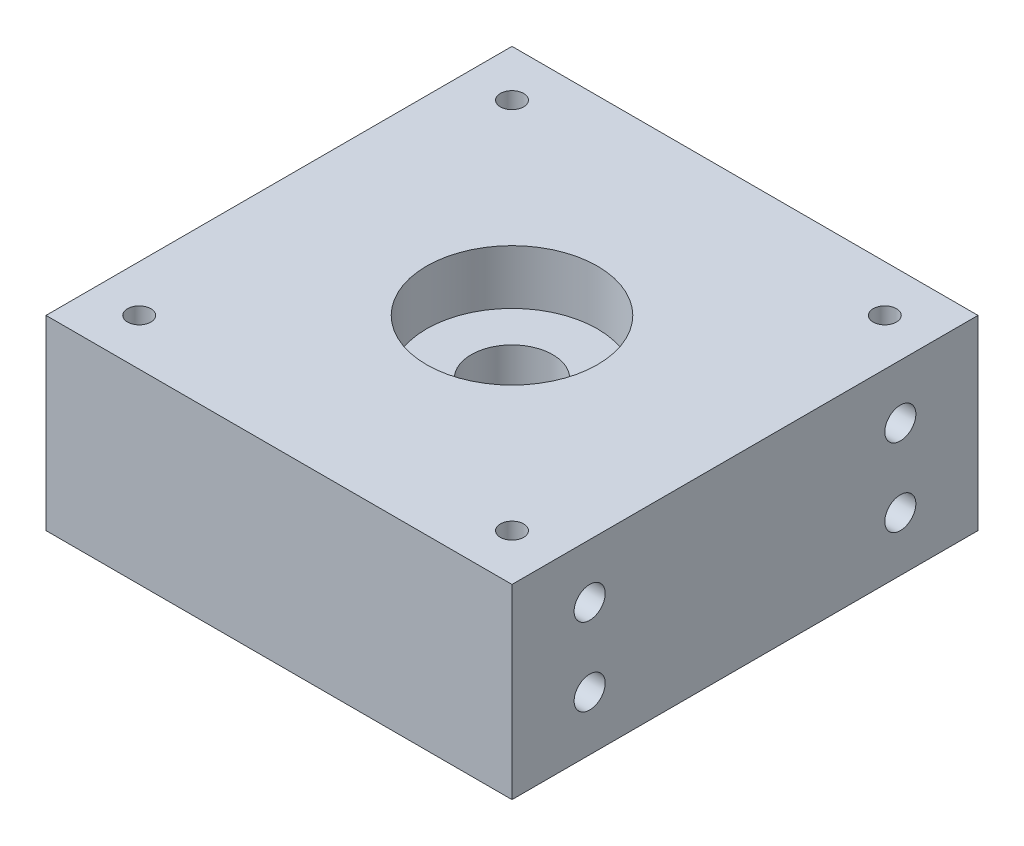
ISO-10303-21;
HEADER;
FILE_DESCRIPTION(('STEP AP214'),'2;1');
FILE_NAME('part.step','',(''),(''),'','','');
FILE_SCHEMA(('AUTOMOTIVE_DESIGN { 1 0 10303 214 1 1 1 1 }'));
ENDSEC;
DATA;
#1=APPLICATION_CONTEXT('core data for automotive mechanical design processes');
#2=APPLICATION_PROTOCOL_DEFINITION('international standard','automotive_design',2000,#1);
#3=PRODUCT_CONTEXT('',#1,'mechanical');
#4=PRODUCT('Part','Part','',(#3));
#5=PRODUCT_RELATED_PRODUCT_CATEGORY('part','',(#4));
#6=PRODUCT_DEFINITION_FORMATION('','',#4);
#7=PRODUCT_DEFINITION_CONTEXT('part definition',#1,'design');
#8=PRODUCT_DEFINITION('design','',#6,#7);
#9=PRODUCT_DEFINITION_SHAPE('','',#8);
#10=(LENGTH_UNIT() NAMED_UNIT(*) SI_UNIT(.MILLI.,.METRE.));
#11=(NAMED_UNIT(*) PLANE_ANGLE_UNIT() SI_UNIT($,.RADIAN.));
#12=(NAMED_UNIT(*) SI_UNIT($,.STERADIAN.) SOLID_ANGLE_UNIT());
#13=UNCERTAINTY_MEASURE_WITH_UNIT(LENGTH_MEASURE(1.E-05),#10,'distance_accuracy_value','');
#14=(GEOMETRIC_REPRESENTATION_CONTEXT(3) GLOBAL_UNCERTAINTY_ASSIGNED_CONTEXT((#13)) GLOBAL_UNIT_ASSIGNED_CONTEXT((#10,
#11,#12)) REPRESENTATION_CONTEXT('',''));
#15=CARTESIAN_POINT('',(0.,0.,0.));
#16=DIRECTION('',(0.,0.,1.));
#17=DIRECTION('',(1.,0.,0.));
#18=AXIS2_PLACEMENT_3D('',#15,#16,#17);
#19=CARTESIAN_POINT('',(54.0014,8.0077,6.000003548781));
#20=DIRECTION('',(0.,1.,0.));
#21=DIRECTION('',(0.,0.,1.));
#22=AXIS2_PLACEMENT_3D('',#19,#20,#21);
#23=PLANE('',#22);
#24=CARTESIAN_POINT('',(54.0014,8.0077,6.000003548781));
#25=DIRECTION('',(0.,1.,0.));
#26=DIRECTION('',(0.,0.,1.));
#27=AXIS2_PLACEMENT_3D('',#24,#25,#26);
#28=CIRCLE('',#27,1.5);
#29=CARTESIAN_POINT('',(54.0014,8.0077,7.500003548781));
#30=VERTEX_POINT('',#29);
#31=EDGE_CURVE('E19',#30,#30,#28,.F.);
#32=ORIENTED_EDGE('',*,*,#31,.T.);
#33=EDGE_LOOP('',(#32));
#34=FACE_BOUND('',#33,.T.);
#35=ADVANCED_FACE('F16',(#34),#23,.F.);
#36=CARTESIAN_POINT('',(45.5014,10.0077,14.500003548781));
#37=DIRECTION('',(0.,1.,0.));
#38=DIRECTION('',(0.,0.,1.));
#39=AXIS2_PLACEMENT_3D('',#36,#37,#38);
#40=PLANE('',#39);
#41=CARTESIAN_POINT('',(45.5014,10.0077,14.500003548781));
#42=DIRECTION('',(0.,1.,0.));
#43=DIRECTION('',(0.,0.,1.));
#44=AXIS2_PLACEMENT_3D('',#41,#42,#43);
#45=CIRCLE('',#44,2.);
#46=CARTESIAN_POINT('',(45.5014,10.0077,16.500003548781));
#47=VERTEX_POINT('',#46);
#48=EDGE_CURVE('E212',#47,#47,#45,.F.);
#49=ORIENTED_EDGE('',*,*,#48,.T.);
#50=EDGE_LOOP('',(#49));
#51=FACE_BOUND('',#50,.T.);
#52=ADVANCED_FACE('F372',(#51),#40,.F.);
#53=CARTESIAN_POINT('',(6.0014,8.0077,6.000003548781));
#54=DIRECTION('',(0.,1.,0.));
#55=DIRECTION('',(0.,0.,1.));
#56=AXIS2_PLACEMENT_3D('',#53,#54,#55);
#57=PLANE('',#56);
#58=CARTESIAN_POINT('',(6.0014,8.0077,6.000003548781));
#59=DIRECTION('',(0.,1.,0.));
#60=DIRECTION('',(0.,0.,1.));
#61=AXIS2_PLACEMENT_3D('',#58,#59,#60);
#62=CIRCLE('',#61,1.5);
#63=CARTESIAN_POINT('',(6.0014,8.0077,7.500003548781));
#64=VERTEX_POINT('',#63);
#65=EDGE_CURVE('E210',#64,#64,#62,.F.);
#66=ORIENTED_EDGE('',*,*,#65,.T.);
#67=EDGE_LOOP('',(#66));
#68=FACE_BOUND('',#67,.T.);
#69=ADVANCED_FACE('F369',(#68),#57,.F.);
#70=CARTESIAN_POINT('',(14.5014,10.0077,14.500003548781));
#71=DIRECTION('',(0.,1.,0.));
#72=DIRECTION('',(0.,0.,1.));
#73=AXIS2_PLACEMENT_3D('',#70,#71,#72);
#74=PLANE('',#73);
#75=CARTESIAN_POINT('',(14.5014,10.0077,14.500003548781));
#76=DIRECTION('',(0.,1.,0.));
#77=DIRECTION('',(0.,0.,1.));
#78=AXIS2_PLACEMENT_3D('',#75,#76,#77);
#79=CIRCLE('',#78,2.);
#80=CARTESIAN_POINT('',(14.5014,10.0077,16.500003548781));
#81=VERTEX_POINT('',#80);
#82=EDGE_CURVE('E207',#81,#81,#79,.F.);
#83=ORIENTED_EDGE('',*,*,#82,.T.);
#84=EDGE_LOOP('',(#83));
#85=FACE_BOUND('',#84,.T.);
#86=ADVANCED_FACE('F371',(#85),#74,.F.);
#87=CARTESIAN_POINT('',(45.5014,10.0077,45.500003548781));
#88=DIRECTION('',(0.,1.,0.));
#89=DIRECTION('',(0.,0.,1.));
#90=AXIS2_PLACEMENT_3D('',#87,#88,#89);
#91=PLANE('',#90);
#92=CARTESIAN_POINT('',(45.5014,10.0077,45.500003548781));
#93=DIRECTION('',(0.,1.,0.));
#94=DIRECTION('',(0.,0.,1.));
#95=AXIS2_PLACEMENT_3D('',#92,#93,#94);
#96=CIRCLE('',#95,2.);
#97=CARTESIAN_POINT('',(45.5014,10.0077,47.500003548781));
#98=VERTEX_POINT('',#97);
#99=EDGE_CURVE('E204',#98,#98,#96,.F.);
#100=ORIENTED_EDGE('',*,*,#99,.T.);
#101=EDGE_LOOP('',(#100));
#102=FACE_BOUND('',#101,.T.);
#103=ADVANCED_FACE('F378',(#102),#91,.F.);
#104=CARTESIAN_POINT('',(54.0014,8.0077,54.000003548781));
#105=DIRECTION('',(0.,1.,0.));
#106=DIRECTION('',(0.,0.,1.));
#107=AXIS2_PLACEMENT_3D('',#104,#105,#106);
#108=PLANE('',#107);
#109=CARTESIAN_POINT('',(54.0014,8.0077,54.000003548781));
#110=DIRECTION('',(0.,1.,0.));
#111=DIRECTION('',(0.,0.,1.));
#112=AXIS2_PLACEMENT_3D('',#109,#110,#111);
#113=CIRCLE('',#112,1.5);
#114=CARTESIAN_POINT('',(54.0014,8.0077,55.500003548781));
#115=VERTEX_POINT('',#114);
#116=EDGE_CURVE('E201',#115,#115,#113,.F.);
#117=ORIENTED_EDGE('',*,*,#116,.T.);
#118=EDGE_LOOP('',(#117));
#119=FACE_BOUND('',#118,.T.);
#120=ADVANCED_FACE('F384',(#119),#108,.F.);
#121=CARTESIAN_POINT('',(14.5014,10.0077,45.500003548781));
#122=DIRECTION('',(0.,1.,0.));
#123=DIRECTION('',(0.,0.,1.));
#124=AXIS2_PLACEMENT_3D('',#121,#122,#123);
#125=PLANE('',#124);
#126=CARTESIAN_POINT('',(14.5014,10.0077,45.500003548781));
#127=DIRECTION('',(0.,1.,0.));
#128=DIRECTION('',(0.,0.,1.));
#129=AXIS2_PLACEMENT_3D('',#126,#127,#128);
#130=CIRCLE('',#129,2.);
#131=CARTESIAN_POINT('',(14.5014,10.0077,47.500003548781));
#132=VERTEX_POINT('',#131);
#133=EDGE_CURVE('E195',#132,#132,#130,.F.);
#134=ORIENTED_EDGE('',*,*,#133,.T.);
#135=EDGE_LOOP('',(#134));
#136=FACE_BOUND('',#135,.T.);
#137=ADVANCED_FACE('F388',(#136),#125,.F.);
#138=CARTESIAN_POINT('',(6.0014,8.0077,54.000003548781));
#139=DIRECTION('',(0.,1.,0.));
#140=DIRECTION('',(0.,0.,1.));
#141=AXIS2_PLACEMENT_3D('',#138,#139,#140);
#142=PLANE('',#141);
#143=CARTESIAN_POINT('',(6.0014,8.0077,54.000003548781));
#144=DIRECTION('',(0.,1.,0.));
#145=DIRECTION('',(0.,0.,1.));
#146=AXIS2_PLACEMENT_3D('',#143,#144,#145);
#147=CIRCLE('',#146,1.5);
#148=CARTESIAN_POINT('',(6.0014,8.0077,55.500003548781));
#149=VERTEX_POINT('',#148);
#150=EDGE_CURVE('E192',#149,#149,#147,.F.);
#151=ORIENTED_EDGE('',*,*,#150,.T.);
#152=EDGE_LOOP('',(#151));
#153=FACE_BOUND('',#152,.T.);
#154=ADVANCED_FACE('F392',(#153),#142,.F.);
#155=CARTESIAN_POINT('',(30.0014,7.0077,30.000003548781));
#156=DIRECTION('',(0.,1.,0.));
#157=DIRECTION('',(0.,0.,1.));
#158=AXIS2_PLACEMENT_3D('',#155,#156,#157);
#159=PLANE('',#158);
#160=CARTESIAN_POINT('',(30.0014,7.0077,30.000003548781));
#161=DIRECTION('',(0.,1.,0.));
#162=DIRECTION('',(0.,0.,1.));
#163=AXIS2_PLACEMENT_3D('',#160,#161,#162);
#164=CIRCLE('',#163,5.25);
#165=CARTESIAN_POINT('',(30.0014,7.0077,35.250003548781));
#166=VERTEX_POINT('',#165);
#167=EDGE_CURVE('E189',#166,#166,#164,.T.);
#168=ORIENTED_EDGE('',*,*,#167,.T.);
#169=EDGE_LOOP('',(#168));
#170=FACE_BOUND('',#169,.T.);
#171=CARTESIAN_POINT('',(30.0014,7.0077,30.000003548781));
#172=DIRECTION('',(0.,1.,0.));
#173=DIRECTION('',(0.,0.,1.));
#174=AXIS2_PLACEMENT_3D('',#171,#172,#173);
#175=CIRCLE('',#174,11.);
#176=CARTESIAN_POINT('',(30.0014,7.0077,41.000003548781));
#177=VERTEX_POINT('',#176);
#178=EDGE_CURVE('E198',#177,#177,#175,.F.);
#179=ORIENTED_EDGE('',*,*,#178,.T.);
#180=EDGE_LOOP('',(#179));
#181=FACE_BOUND('',#180,.T.);
#182=ADVANCED_FACE('F396',(#170,#181),#159,.F.);
#183=CARTESIAN_POINT('',(50.0014,7.0077,50.000003548781));
#184=DIRECTION('',(-1.,0.,0.));
#185=DIRECTION('',(0.,0.,1.));
#186=AXIS2_PLACEMENT_3D('',#183,#184,#185);
#187=PLANE('',#186);
#188=CARTESIAN_POINT('',(50.0014,7.0077,50.000003548781));
#189=DIRECTION('',(-1.,0.,0.));
#190=DIRECTION('',(0.,0.,1.));
#191=AXIS2_PLACEMENT_3D('',#188,#189,#190);
#192=CIRCLE('',#191,2.);
#193=CARTESIAN_POINT('',(50.0014,7.0077,52.000003548781));
#194=VERTEX_POINT('',#193);
#195=EDGE_CURVE('E186',#194,#194,#192,.F.);
#196=ORIENTED_EDGE('',*,*,#195,.T.);
#197=EDGE_LOOP('',(#196));
#198=FACE_BOUND('',#197,.T.);
#199=ADVANCED_FACE('F400',(#198),#187,.F.);
#200=CARTESIAN_POINT('',(50.0014,17.0077,50.000003548781));
#201=DIRECTION('',(-1.,0.,0.));
#202=DIRECTION('',(0.,0.,1.));
#203=AXIS2_PLACEMENT_3D('',#200,#201,#202);
#204=PLANE('',#203);
#205=CARTESIAN_POINT('',(50.0014,17.0077,50.000003548781));
#206=DIRECTION('',(-1.,0.,0.));
#207=DIRECTION('',(0.,0.,1.));
#208=AXIS2_PLACEMENT_3D('',#205,#206,#207);
#209=CIRCLE('',#208,2.);
#210=CARTESIAN_POINT('',(50.0014,17.0077,52.000003548781));
#211=VERTEX_POINT('',#210);
#212=EDGE_CURVE('E183',#211,#211,#209,.F.);
#213=ORIENTED_EDGE('',*,*,#212,.T.);
#214=EDGE_LOOP('',(#213));
#215=FACE_BOUND('',#214,.T.);
#216=ADVANCED_FACE('F404',(#215),#204,.F.);
#217=CARTESIAN_POINT('',(50.0014,7.0077,10.000003548781));
#218=DIRECTION('',(-1.,0.,0.));
#219=DIRECTION('',(0.,0.,1.));
#220=AXIS2_PLACEMENT_3D('',#217,#218,#219);
#221=PLANE('',#220);
#222=CARTESIAN_POINT('',(50.0014,7.0077,10.000003548781));
#223=DIRECTION('',(-1.,0.,0.));
#224=DIRECTION('',(0.,0.,1.));
#225=AXIS2_PLACEMENT_3D('',#222,#223,#224);
#226=CIRCLE('',#225,2.);
#227=CARTESIAN_POINT('',(50.0014,7.0077,12.000003548781));
#228=VERTEX_POINT('',#227);
#229=EDGE_CURVE('E180',#228,#228,#226,.F.);
#230=ORIENTED_EDGE('',*,*,#229,.T.);
#231=EDGE_LOOP('',(#230));
#232=FACE_BOUND('',#231,.T.);
#233=ADVANCED_FACE('F408',(#232),#221,.F.);
#234=CARTESIAN_POINT('',(50.0014,17.0077,10.000003548781));
#235=DIRECTION('',(-1.,0.,0.));
#236=DIRECTION('',(0.,0.,1.));
#237=AXIS2_PLACEMENT_3D('',#234,#235,#236);
#238=PLANE('',#237);
#239=CARTESIAN_POINT('',(50.0014,17.0077,10.000003548781));
#240=DIRECTION('',(-1.,0.,0.));
#241=DIRECTION('',(0.,0.,1.));
#242=AXIS2_PLACEMENT_3D('',#239,#240,#241);
#243=CIRCLE('',#242,2.);
#244=CARTESIAN_POINT('',(50.0014,17.0077,12.000003548781));
#245=VERTEX_POINT('',#244);
#246=EDGE_CURVE('E177',#245,#245,#243,.F.);
#247=ORIENTED_EDGE('',*,*,#246,.T.);
#248=EDGE_LOOP('',(#247));
#249=FACE_BOUND('',#248,.T.);
#250=ADVANCED_FACE('F412',(#249),#238,.F.);
#251=CARTESIAN_POINT('',(10.0014,7.0077,50.000003548781));
#252=DIRECTION('',(1.,0.,0.));
#253=DIRECTION('',(0.,0.,-1.));
#254=AXIS2_PLACEMENT_3D('',#251,#252,#253);
#255=PLANE('',#254);
#256=CARTESIAN_POINT('',(10.0014,7.0077,50.000003548781));
#257=DIRECTION('',(1.,0.,0.));
#258=DIRECTION('',(0.,0.,-1.));
#259=AXIS2_PLACEMENT_3D('',#256,#257,#258);
#260=CIRCLE('',#259,2.);
#261=CARTESIAN_POINT('',(10.0014,7.0077,48.000003548781));
#262=VERTEX_POINT('',#261);
#263=EDGE_CURVE('E174',#262,#262,#260,.F.);
#264=ORIENTED_EDGE('',*,*,#263,.T.);
#265=EDGE_LOOP('',(#264));
#266=FACE_BOUND('',#265,.T.);
#267=ADVANCED_FACE('F416',(#266),#255,.F.);
#268=CARTESIAN_POINT('',(10.0014,17.0077,50.000003548781));
#269=DIRECTION('',(1.,0.,0.));
#270=DIRECTION('',(0.,0.,-1.));
#271=AXIS2_PLACEMENT_3D('',#268,#269,#270);
#272=PLANE('',#271);
#273=CARTESIAN_POINT('',(10.0014,17.0077,50.000003548781));
#274=DIRECTION('',(1.,0.,0.));
#275=DIRECTION('',(0.,0.,-1.));
#276=AXIS2_PLACEMENT_3D('',#273,#274,#275);
#277=CIRCLE('',#276,2.);
#278=CARTESIAN_POINT('',(10.0014,17.0077,48.000003548781));
#279=VERTEX_POINT('',#278);
#280=EDGE_CURVE('E171',#279,#279,#277,.F.);
#281=ORIENTED_EDGE('',*,*,#280,.T.);
#282=EDGE_LOOP('',(#281));
#283=FACE_BOUND('',#282,.T.);
#284=ADVANCED_FACE('F420',(#283),#272,.F.);
#285=CARTESIAN_POINT('',(10.0014,7.0077,10.000003548781));
#286=DIRECTION('',(1.,0.,0.));
#287=DIRECTION('',(0.,0.,-1.));
#288=AXIS2_PLACEMENT_3D('',#285,#286,#287);
#289=PLANE('',#288);
#290=CARTESIAN_POINT('',(10.0014,7.0077,10.000003548781));
#291=DIRECTION('',(1.,0.,0.));
#292=DIRECTION('',(0.,0.,-1.));
#293=AXIS2_PLACEMENT_3D('',#290,#291,#292);
#294=CIRCLE('',#293,2.);
#295=CARTESIAN_POINT('',(10.0014,7.0077,8.000003548781));
#296=VERTEX_POINT('',#295);
#297=EDGE_CURVE('E168',#296,#296,#294,.F.);
#298=ORIENTED_EDGE('',*,*,#297,.T.);
#299=EDGE_LOOP('',(#298));
#300=FACE_BOUND('',#299,.T.);
#301=ADVANCED_FACE('F234',(#300),#289,.F.);
#302=CARTESIAN_POINT('',(10.0014,17.0077,10.000003548781));
#303=DIRECTION('',(1.,0.,0.));
#304=DIRECTION('',(0.,0.,-1.));
#305=AXIS2_PLACEMENT_3D('',#302,#303,#304);
#306=PLANE('',#305);
#307=CARTESIAN_POINT('',(10.0014,17.0077,10.000003548781));
#308=DIRECTION('',(1.,0.,0.));
#309=DIRECTION('',(0.,0.,-1.));
#310=AXIS2_PLACEMENT_3D('',#307,#308,#309);
#311=CIRCLE('',#310,2.);
#312=CARTESIAN_POINT('',(10.0014,17.0077,8.000003548781));
#313=VERTEX_POINT('',#312);
#314=EDGE_CURVE('E165',#313,#313,#311,.F.);
#315=ORIENTED_EDGE('',*,*,#314,.T.);
#316=EDGE_LOOP('',(#315));
#317=FACE_BOUND('',#316,.T.);
#318=ADVANCED_FACE('F223',(#317),#306,.F.);
#319=CARTESIAN_POINT('',(54.0014,0.007700000000114,6.000003548781));
#320=DIRECTION('',(0.,1.,0.));
#321=DIRECTION('',(0.,0.,1.));
#322=AXIS2_PLACEMENT_3D('',#319,#320,#321);
#323=CYLINDRICAL_SURFACE('',#322,1.5);
#324=CARTESIAN_POINT('',(54.0014,0.0077,6.000003548781));
#325=DIRECTION('',(0.,1.,0.));
#326=DIRECTION('',(0.,0.,1.));
#327=AXIS2_PLACEMENT_3D('',#324,#325,#326);
#328=CIRCLE('',#327,1.5);
#329=CARTESIAN_POINT('',(54.0014,0.0077,7.500003548781));
#330=VERTEX_POINT('',#329);
#331=EDGE_CURVE('E162',#330,#330,#328,.F.);
#332=ORIENTED_EDGE('',*,*,#331,.T.);
#333=EDGE_LOOP('',(#332));
#334=FACE_BOUND('',#333,.T.);
#335=ORIENTED_EDGE('',*,*,#31,.F.);
#336=EDGE_LOOP('',(#335));
#337=FACE_BOUND('',#336,.T.);
#338=ADVANCED_FACE('F220',(#334,#337),#323,.F.);
#339=CARTESIAN_POINT('',(45.5014,0.007700000000114,14.500003548781));
#340=DIRECTION('',(0.,1.,0.));
#341=DIRECTION('',(0.,0.,1.));
#342=AXIS2_PLACEMENT_3D('',#339,#340,#341);
#343=CYLINDRICAL_SURFACE('',#342,2.);
#344=CARTESIAN_POINT('',(45.5014,0.0077,14.500003548781));
#345=DIRECTION('',(0.,1.,0.));
#346=DIRECTION('',(0.,0.,1.));
#347=AXIS2_PLACEMENT_3D('',#344,#345,#346);
#348=CIRCLE('',#347,2.);
#349=CARTESIAN_POINT('',(45.5014,0.0077,16.500003548781));
#350=VERTEX_POINT('',#349);
#351=EDGE_CURVE('E159',#350,#350,#348,.F.);
#352=ORIENTED_EDGE('',*,*,#351,.T.);
#353=EDGE_LOOP('',(#352));
#354=FACE_BOUND('',#353,.T.);
#355=ORIENTED_EDGE('',*,*,#48,.F.);
#356=EDGE_LOOP('',(#355));
#357=FACE_BOUND('',#356,.T.);
#358=ADVANCED_FACE('F222',(#354,#357),#343,.F.);
#359=CARTESIAN_POINT('',(6.0014,0.007700000000114,6.000003548781));
#360=DIRECTION('',(0.,1.,0.));
#361=DIRECTION('',(0.,0.,1.));
#362=AXIS2_PLACEMENT_3D('',#359,#360,#361);
#363=CYLINDRICAL_SURFACE('',#362,1.5);
#364=CARTESIAN_POINT('',(6.0014,0.0077,6.000003548781));
#365=DIRECTION('',(0.,1.,0.));
#366=DIRECTION('',(0.,0.,1.));
#367=AXIS2_PLACEMENT_3D('',#364,#365,#366);
#368=CIRCLE('',#367,1.5);
#369=CARTESIAN_POINT('',(6.0014,0.0077,7.500003548781));
#370=VERTEX_POINT('',#369);
#371=EDGE_CURVE('E156',#370,#370,#368,.F.);
#372=ORIENTED_EDGE('',*,*,#371,.T.);
#373=EDGE_LOOP('',(#372));
#374=FACE_BOUND('',#373,.T.);
#375=ORIENTED_EDGE('',*,*,#65,.F.);
#376=EDGE_LOOP('',(#375));
#377=FACE_BOUND('',#376,.T.);
#378=ADVANCED_FACE('F231',(#374,#377),#363,.F.);
#379=CARTESIAN_POINT('',(14.5014,0.007700000000114,14.500003548781));
#380=DIRECTION('',(0.,1.,0.));
#381=DIRECTION('',(0.,0.,1.));
#382=AXIS2_PLACEMENT_3D('',#379,#380,#381);
#383=CYLINDRICAL_SURFACE('',#382,2.);
#384=CARTESIAN_POINT('',(14.5014,0.0077,14.500003548781));
#385=DIRECTION('',(0.,1.,0.));
#386=DIRECTION('',(0.,0.,1.));
#387=AXIS2_PLACEMENT_3D('',#384,#385,#386);
#388=CIRCLE('',#387,2.);
#389=CARTESIAN_POINT('',(14.5014,0.0077,16.500003548781));
#390=VERTEX_POINT('',#389);
#391=EDGE_CURVE('E153',#390,#390,#388,.F.);
#392=ORIENTED_EDGE('',*,*,#391,.T.);
#393=EDGE_LOOP('',(#392));
#394=FACE_BOUND('',#393,.T.);
#395=ORIENTED_EDGE('',*,*,#82,.F.);
#396=EDGE_LOOP('',(#395));
#397=FACE_BOUND('',#396,.T.);
#398=ADVANCED_FACE('F356',(#394,#397),#383,.F.);
#399=CARTESIAN_POINT('',(45.5014,0.007700000000114,45.500003548781));
#400=DIRECTION('',(0.,1.,0.));
#401=DIRECTION('',(0.,0.,1.));
#402=AXIS2_PLACEMENT_3D('',#399,#400,#401);
#403=CYLINDRICAL_SURFACE('',#402,2.);
#404=CARTESIAN_POINT('',(45.5014,0.0077,45.500003548781));
#405=DIRECTION('',(0.,1.,0.));
#406=DIRECTION('',(0.,0.,1.));
#407=AXIS2_PLACEMENT_3D('',#404,#405,#406);
#408=CIRCLE('',#407,2.);
#409=CARTESIAN_POINT('',(45.5014,0.0077,47.500003548781));
#410=VERTEX_POINT('',#409);
#411=EDGE_CURVE('E150',#410,#410,#408,.F.);
#412=ORIENTED_EDGE('',*,*,#411,.T.);
#413=EDGE_LOOP('',(#412));
#414=FACE_BOUND('',#413,.T.);
#415=ORIENTED_EDGE('',*,*,#99,.F.);
#416=EDGE_LOOP('',(#415));
#417=FACE_BOUND('',#416,.T.);
#418=ADVANCED_FACE('F352',(#414,#417),#403,.F.);
#419=CARTESIAN_POINT('',(54.0014,0.007700000000114,54.000003548781));
#420=DIRECTION('',(0.,1.,0.));
#421=DIRECTION('',(0.,0.,1.));
#422=AXIS2_PLACEMENT_3D('',#419,#420,#421);
#423=CYLINDRICAL_SURFACE('',#422,1.5);
#424=CARTESIAN_POINT('',(54.0014,0.0077,54.000003548781));
#425=DIRECTION('',(0.,1.,0.));
#426=DIRECTION('',(0.,0.,1.));
#427=AXIS2_PLACEMENT_3D('',#424,#425,#426);
#428=CIRCLE('',#427,1.5);
#429=CARTESIAN_POINT('',(54.0014,0.0077,55.500003548781));
#430=VERTEX_POINT('',#429);
#431=EDGE_CURVE('E147',#430,#430,#428,.F.);
#432=ORIENTED_EDGE('',*,*,#431,.T.);
#433=EDGE_LOOP('',(#432));
#434=FACE_BOUND('',#433,.T.);
#435=ORIENTED_EDGE('',*,*,#116,.F.);
#436=EDGE_LOOP('',(#435));
#437=FACE_BOUND('',#436,.T.);
#438=ADVANCED_FACE('F348',(#434,#437),#423,.F.);
#439=CARTESIAN_POINT('',(30.0014,0.007700000000114,30.000003548781));
#440=DIRECTION('',(0.,1.,0.));
#441=DIRECTION('',(0.,0.,1.));
#442=AXIS2_PLACEMENT_3D('',#439,#440,#441);
#443=CYLINDRICAL_SURFACE('',#442,11.);
#444=CARTESIAN_POINT('',(30.0014,0.0077,30.000003548781));
#445=DIRECTION('',(0.,1.,0.));
#446=DIRECTION('',(0.,0.,1.));
#447=AXIS2_PLACEMENT_3D('',#444,#445,#446);
#448=CIRCLE('',#447,11.);
#449=CARTESIAN_POINT('',(30.0014,0.0077,41.000003548781));
#450=VERTEX_POINT('',#449);
#451=EDGE_CURVE('E144',#450,#450,#448,.F.);
#452=ORIENTED_EDGE('',*,*,#451,.T.);
#453=EDGE_LOOP('',(#452));
#454=FACE_BOUND('',#453,.T.);
#455=ORIENTED_EDGE('',*,*,#178,.F.);
#456=EDGE_LOOP('',(#455));
#457=FACE_BOUND('',#456,.T.);
#458=ADVANCED_FACE('F344',(#454,#457),#443,.F.);
#459=CARTESIAN_POINT('',(14.5014,0.007700000000114,45.500003548781));
#460=DIRECTION('',(0.,1.,0.));
#461=DIRECTION('',(0.,0.,1.));
#462=AXIS2_PLACEMENT_3D('',#459,#460,#461);
#463=CYLINDRICAL_SURFACE('',#462,2.);
#464=CARTESIAN_POINT('',(14.5014,0.0077,45.500003548781));
#465=DIRECTION('',(0.,1.,0.));
#466=DIRECTION('',(0.,0.,1.));
#467=AXIS2_PLACEMENT_3D('',#464,#465,#466);
#468=CIRCLE('',#467,2.);
#469=CARTESIAN_POINT('',(14.5014,0.0077,47.500003548781));
#470=VERTEX_POINT('',#469);
#471=EDGE_CURVE('E141',#470,#470,#468,.F.);
#472=ORIENTED_EDGE('',*,*,#471,.T.);
#473=EDGE_LOOP('',(#472));
#474=FACE_BOUND('',#473,.T.);
#475=ORIENTED_EDGE('',*,*,#133,.F.);
#476=EDGE_LOOP('',(#475));
#477=FACE_BOUND('',#476,.T.);
#478=ADVANCED_FACE('F340',(#474,#477),#463,.F.);
#479=CARTESIAN_POINT('',(6.0014,0.007700000000114,54.000003548781));
#480=DIRECTION('',(0.,1.,0.));
#481=DIRECTION('',(0.,0.,1.));
#482=AXIS2_PLACEMENT_3D('',#479,#480,#481);
#483=CYLINDRICAL_SURFACE('',#482,1.5);
#484=CARTESIAN_POINT('',(6.0014,0.0077,54.000003548781));
#485=DIRECTION('',(0.,1.,0.));
#486=DIRECTION('',(0.,0.,1.));
#487=AXIS2_PLACEMENT_3D('',#484,#485,#486);
#488=CIRCLE('',#487,1.5);
#489=CARTESIAN_POINT('',(6.0014,0.0077,55.500003548781));
#490=VERTEX_POINT('',#489);
#491=EDGE_CURVE('E138',#490,#490,#488,.F.);
#492=ORIENTED_EDGE('',*,*,#491,.T.);
#493=EDGE_LOOP('',(#492));
#494=FACE_BOUND('',#493,.T.);
#495=ORIENTED_EDGE('',*,*,#150,.F.);
#496=EDGE_LOOP('',(#495));
#497=FACE_BOUND('',#496,.T.);
#498=ADVANCED_FACE('F336',(#494,#497),#483,.F.);
#499=CARTESIAN_POINT('',(30.0014,0.007700000000114,30.000003548781));
#500=DIRECTION('',(0.,1.,0.));
#501=DIRECTION('',(0.,0.,1.));
#502=AXIS2_PLACEMENT_3D('',#499,#500,#501);
#503=CYLINDRICAL_SURFACE('',#502,5.25);
#504=CARTESIAN_POINT('',(30.0014,17.0077,30.000003548781));
#505=DIRECTION('',(0.,1.,0.));
#506=DIRECTION('',(0.,0.,1.));
#507=AXIS2_PLACEMENT_3D('',#504,#505,#506);
#508=CIRCLE('',#507,5.25);
#509=CARTESIAN_POINT('',(30.0014,17.0077,35.250003548781));
#510=VERTEX_POINT('',#509);
#511=EDGE_CURVE('E74',#510,#510,#508,.F.);
#512=ORIENTED_EDGE('',*,*,#511,.F.);
#513=EDGE_LOOP('',(#512));
#514=FACE_BOUND('',#513,.T.);
#515=ORIENTED_EDGE('',*,*,#167,.F.);
#516=EDGE_LOOP('',(#515));
#517=FACE_BOUND('',#516,.T.);
#518=ADVANCED_FACE('F332',(#514,#517),#503,.F.);
#519=CARTESIAN_POINT('',(60.0014,7.0077,50.000003548781));
#520=DIRECTION('',(-1.,0.,0.));
#521=DIRECTION('',(0.,0.,1.));
#522=AXIS2_PLACEMENT_3D('',#519,#520,#521);
#523=CYLINDRICAL_SURFACE('',#522,2.);
#524=CARTESIAN_POINT('',(60.0014,7.0077,50.000003548781));
#525=DIRECTION('',(-1.,0.,0.));
#526=DIRECTION('',(0.,0.,1.));
#527=AXIS2_PLACEMENT_3D('',#524,#525,#526);
#528=CIRCLE('',#527,2.);
#529=CARTESIAN_POINT('',(60.0014,7.0077,52.000003548781));
#530=VERTEX_POINT('',#529);
#531=EDGE_CURVE('E73',#530,#530,#528,.F.);
#532=ORIENTED_EDGE('',*,*,#531,.T.);
#533=EDGE_LOOP('',(#532));
#534=FACE_BOUND('',#533,.T.);
#535=ORIENTED_EDGE('',*,*,#195,.F.);
#536=EDGE_LOOP('',(#535));
#537=FACE_BOUND('',#536,.T.);
#538=ADVANCED_FACE('F328',(#534,#537),#523,.F.);
#539=CARTESIAN_POINT('',(60.0014,17.0077,50.000003548781));
#540=DIRECTION('',(-1.,0.,0.));
#541=DIRECTION('',(0.,0.,1.));
#542=AXIS2_PLACEMENT_3D('',#539,#540,#541);
#543=CYLINDRICAL_SURFACE('',#542,2.);
#544=CARTESIAN_POINT('',(60.0014,17.0077,50.000003548781));
#545=DIRECTION('',(-1.,0.,0.));
#546=DIRECTION('',(0.,0.,1.));
#547=AXIS2_PLACEMENT_3D('',#544,#545,#546);
#548=CIRCLE('',#547,2.);
#549=CARTESIAN_POINT('',(60.0014,17.0077,52.000003548781));
#550=VERTEX_POINT('',#549);
#551=EDGE_CURVE('E131',#550,#550,#548,.F.);
#552=ORIENTED_EDGE('',*,*,#551,.T.);
#553=EDGE_LOOP('',(#552));
#554=FACE_BOUND('',#553,.T.);
#555=ORIENTED_EDGE('',*,*,#212,.F.);
#556=EDGE_LOOP('',(#555));
#557=FACE_BOUND('',#556,.T.);
#558=ADVANCED_FACE('F324',(#554,#557),#543,.F.);
#559=CARTESIAN_POINT('',(60.0014,7.0077,10.000003548781));
#560=DIRECTION('',(-1.,0.,0.));
#561=DIRECTION('',(0.,0.,1.));
#562=AXIS2_PLACEMENT_3D('',#559,#560,#561);
#563=CYLINDRICAL_SURFACE('',#562,2.);
#564=CARTESIAN_POINT('',(60.0014,7.0077,10.000003548781));
#565=DIRECTION('',(-1.,0.,0.));
#566=DIRECTION('',(0.,0.,1.));
#567=AXIS2_PLACEMENT_3D('',#564,#565,#566);
#568=CIRCLE('',#567,2.);
#569=CARTESIAN_POINT('',(60.0014,7.0077,12.000003548781));
#570=VERTEX_POINT('',#569);
#571=EDGE_CURVE('E128',#570,#570,#568,.F.);
#572=ORIENTED_EDGE('',*,*,#571,.T.);
#573=EDGE_LOOP('',(#572));
#574=FACE_BOUND('',#573,.T.);
#575=ORIENTED_EDGE('',*,*,#229,.F.);
#576=EDGE_LOOP('',(#575));
#577=FACE_BOUND('',#576,.T.);
#578=ADVANCED_FACE('F320',(#574,#577),#563,.F.);
#579=CARTESIAN_POINT('',(60.0014,17.0077,10.000003548781));
#580=DIRECTION('',(-1.,0.,0.));
#581=DIRECTION('',(0.,0.,1.));
#582=AXIS2_PLACEMENT_3D('',#579,#580,#581);
#583=CYLINDRICAL_SURFACE('',#582,2.);
#584=CARTESIAN_POINT('',(60.0014,17.0077,10.000003548781));
#585=DIRECTION('',(-1.,0.,0.));
#586=DIRECTION('',(0.,0.,1.));
#587=AXIS2_PLACEMENT_3D('',#584,#585,#586);
#588=CIRCLE('',#587,2.);
#589=CARTESIAN_POINT('',(60.0014,17.0077,12.000003548781));
#590=VERTEX_POINT('',#589);
#591=EDGE_CURVE('E65',#590,#590,#588,.F.);
#592=ORIENTED_EDGE('',*,*,#591,.T.);
#593=EDGE_LOOP('',(#592));
#594=FACE_BOUND('',#593,.T.);
#595=ORIENTED_EDGE('',*,*,#246,.F.);
#596=EDGE_LOOP('',(#595));
#597=FACE_BOUND('',#596,.T.);
#598=ADVANCED_FACE('F316',(#594,#597),#583,.F.);
#599=CARTESIAN_POINT('',(0.00139999999999,7.0077,50.000003548781));
#600=DIRECTION('',(1.,0.,0.));
#601=DIRECTION('',(0.,0.,-1.));
#602=AXIS2_PLACEMENT_3D('',#599,#600,#601);
#603=CYLINDRICAL_SURFACE('',#602,2.);
#604=CARTESIAN_POINT('',(0.001399999999997,7.0077,50.000003548781));
#605=DIRECTION('',(1.,0.,0.));
#606=DIRECTION('',(0.,0.,-1.));
#607=AXIS2_PLACEMENT_3D('',#604,#605,#606);
#608=CIRCLE('',#607,2.);
#609=CARTESIAN_POINT('',(0.001399999999997,7.0077,48.000003548781));
#610=VERTEX_POINT('',#609);
#611=EDGE_CURVE('E123',#610,#610,#608,.T.);
#612=ORIENTED_EDGE('',*,*,#611,.F.);
#613=EDGE_LOOP('',(#612));
#614=FACE_BOUND('',#613,.T.);
#615=ORIENTED_EDGE('',*,*,#263,.F.);
#616=EDGE_LOOP('',(#615));
#617=FACE_BOUND('',#616,.T.);
#618=ADVANCED_FACE('F312',(#614,#617),#603,.F.);
#619=CARTESIAN_POINT('',(0.00139999999999,17.0077,50.000003548781));
#620=DIRECTION('',(1.,0.,0.));
#621=DIRECTION('',(0.,0.,-1.));
#622=AXIS2_PLACEMENT_3D('',#619,#620,#621);
#623=CYLINDRICAL_SURFACE('',#622,2.);
#624=CARTESIAN_POINT('',(0.001399999999997,17.0077,50.000003548781));
#625=DIRECTION('',(1.,0.,0.));
#626=DIRECTION('',(0.,0.,-1.));
#627=AXIS2_PLACEMENT_3D('',#624,#625,#626);
#628=CIRCLE('',#627,2.);
#629=CARTESIAN_POINT('',(0.001399999999997,17.0077,48.000003548781));
#630=VERTEX_POINT('',#629);
#631=EDGE_CURVE('E120',#630,#630,#628,.T.);
#632=ORIENTED_EDGE('',*,*,#631,.F.);
#633=EDGE_LOOP('',(#632));
#634=FACE_BOUND('',#633,.T.);
#635=ORIENTED_EDGE('',*,*,#280,.F.);
#636=EDGE_LOOP('',(#635));
#637=FACE_BOUND('',#636,.T.);
#638=ADVANCED_FACE('F308',(#634,#637),#623,.F.);
#639=CARTESIAN_POINT('',(0.00139999999999,7.0077,10.000003548781));
#640=DIRECTION('',(1.,0.,0.));
#641=DIRECTION('',(0.,0.,-1.));
#642=AXIS2_PLACEMENT_3D('',#639,#640,#641);
#643=CYLINDRICAL_SURFACE('',#642,2.);
#644=CARTESIAN_POINT('',(0.001399999999997,7.0077,10.000003548781));
#645=DIRECTION('',(1.,0.,0.));
#646=DIRECTION('',(0.,0.,-1.));
#647=AXIS2_PLACEMENT_3D('',#644,#645,#646);
#648=CIRCLE('',#647,2.);
#649=CARTESIAN_POINT('',(0.001399999999997,7.0077,8.000003548781));
#650=VERTEX_POINT('',#649);
#651=EDGE_CURVE('E117',#650,#650,#648,.T.);
#652=ORIENTED_EDGE('',*,*,#651,.F.);
#653=EDGE_LOOP('',(#652));
#654=FACE_BOUND('',#653,.T.);
#655=ORIENTED_EDGE('',*,*,#297,.F.);
#656=EDGE_LOOP('',(#655));
#657=FACE_BOUND('',#656,.T.);
#658=ADVANCED_FACE('F304',(#654,#657),#643,.F.);
#659=CARTESIAN_POINT('',(0.00139999999999,17.0077,10.000003548781));
#660=DIRECTION('',(1.,0.,0.));
#661=DIRECTION('',(0.,0.,-1.));
#662=AXIS2_PLACEMENT_3D('',#659,#660,#661);
#663=CYLINDRICAL_SURFACE('',#662,2.);
#664=CARTESIAN_POINT('',(0.001399999999997,17.0077,10.000003548781));
#665=DIRECTION('',(1.,0.,0.));
#666=DIRECTION('',(0.,0.,-1.));
#667=AXIS2_PLACEMENT_3D('',#664,#665,#666);
#668=CIRCLE('',#667,2.);
#669=CARTESIAN_POINT('',(0.001399999999997,17.0077,8.000003548781));
#670=VERTEX_POINT('',#669);
#671=EDGE_CURVE('E113',#670,#670,#668,.T.);
#672=ORIENTED_EDGE('',*,*,#671,.F.);
#673=EDGE_LOOP('',(#672));
#674=FACE_BOUND('',#673,.T.);
#675=ORIENTED_EDGE('',*,*,#314,.F.);
#676=EDGE_LOOP('',(#675));
#677=FACE_BOUND('',#676,.T.);
#678=ADVANCED_FACE('F300',(#674,#677),#663,.F.);
#679=CARTESIAN_POINT('',(60.0014,0.007700000000114,3.54878102371E-06));
#680=DIRECTION('',(0.,1.,0.));
#681=DIRECTION('',(0.,0.,1.));
#682=AXIS2_PLACEMENT_3D('',#679,#680,#681);
#683=PLANE('',#682);
#684=ORIENTED_EDGE('',*,*,#491,.F.);
#685=EDGE_LOOP('',(#684));
#686=FACE_BOUND('',#685,.T.);
#687=ORIENTED_EDGE('',*,*,#471,.F.);
#688=EDGE_LOOP('',(#687));
#689=FACE_BOUND('',#688,.T.);
#690=ORIENTED_EDGE('',*,*,#451,.F.);
#691=EDGE_LOOP('',(#690));
#692=FACE_BOUND('',#691,.T.);
#693=ORIENTED_EDGE('',*,*,#431,.F.);
#694=EDGE_LOOP('',(#693));
#695=FACE_BOUND('',#694,.T.);
#696=ORIENTED_EDGE('',*,*,#411,.F.);
#697=EDGE_LOOP('',(#696));
#698=FACE_BOUND('',#697,.T.);
#699=ORIENTED_EDGE('',*,*,#391,.F.);
#700=EDGE_LOOP('',(#699));
#701=FACE_BOUND('',#700,.T.);
#702=ORIENTED_EDGE('',*,*,#371,.F.);
#703=EDGE_LOOP('',(#702));
#704=FACE_BOUND('',#703,.T.);
#705=ORIENTED_EDGE('',*,*,#351,.F.);
#706=EDGE_LOOP('',(#705));
#707=FACE_BOUND('',#706,.T.);
#708=ORIENTED_EDGE('',*,*,#331,.F.);
#709=EDGE_LOOP('',(#708));
#710=FACE_BOUND('',#709,.T.);
#711=DIRECTION('',(0.,0.,1.));
#712=VECTOR('',#711,1.);
#713=CARTESIAN_POINT('',(0.00139999999999,0.0077,3.54878102371E-06));
#714=LINE('',#713,#712);
#715=CARTESIAN_POINT('',(0.00139999999999647,0.0077000000000285,3.548780910023E-06));
#716=VERTEX_POINT('',#715);
#717=CARTESIAN_POINT('',(0.00139999999999647,0.007700000000057,60.000003548781));
#718=VERTEX_POINT('',#717);
#719=EDGE_CURVE('E62',#716,#718,#714,.T.);
#720=ORIENTED_EDGE('',*,*,#719,.F.);
#721=DIRECTION('',(1.,0.,0.));
#722=VECTOR('',#721,1.);
#723=CARTESIAN_POINT('',(60.0014,0.0077,3.54878102371E-06));
#724=LINE('',#723,#722);
#725=CARTESIAN_POINT('',(60.0014,0.007700000000057,3.5487808531795E-06));
#726=VERTEX_POINT('',#725);
#727=EDGE_CURVE('E55',#716,#726,#724,.T.);
#728=ORIENTED_EDGE('',*,*,#727,.T.);
#729=DIRECTION('',(0.,0.,1.));
#730=VECTOR('',#729,1.);
#731=CARTESIAN_POINT('',(60.0014,0.0077,3.54878102371E-06));
#732=LINE('',#731,#730);
#733=CARTESIAN_POINT('',(60.0014,0.007700000000057,60.000003548781));
#734=VERTEX_POINT('',#733);
#735=EDGE_CURVE('E60',#726,#734,#732,.T.);
#736=ORIENTED_EDGE('',*,*,#735,.T.);
#737=DIRECTION('',(1.,0.,0.));
#738=VECTOR('',#737,1.);
#739=CARTESIAN_POINT('',(60.0014,0.0077,60.000003548781));
#740=LINE('',#739,#738);
#741=EDGE_CURVE('E116',#718,#734,#740,.T.);
#742=ORIENTED_EDGE('',*,*,#741,.F.);
#743=EDGE_LOOP('',(#720,#728,#736,#742));
#744=FACE_BOUND('',#743,.T.);
#745=ADVANCED_FACE('F59',(#686,#689,#692,#695,#698,#701,#704,#707,#710,#744),#683,.F.);
#746=CARTESIAN_POINT('',(54.0014,16.0077,6.000003548781));
#747=DIRECTION('',(0.,1.,0.));
#748=DIRECTION('',(0.,0.,1.));
#749=AXIS2_PLACEMENT_3D('',#746,#747,#748);
#750=PLANE('',#749);
#751=CARTESIAN_POINT('',(54.0014,16.0077,6.000003548781));
#752=DIRECTION('',(0.,1.,0.));
#753=DIRECTION('',(0.,0.,1.));
#754=AXIS2_PLACEMENT_3D('',#751,#752,#753);
#755=CIRCLE('',#754,1.5);
#756=CARTESIAN_POINT('',(54.0014,16.0077,7.500003548781));
#757=VERTEX_POINT('',#756);
#758=EDGE_CURVE('E110',#757,#757,#755,.T.);
#759=ORIENTED_EDGE('',*,*,#758,.T.);
#760=EDGE_LOOP('',(#759));
#761=FACE_BOUND('',#760,.T.);
#762=ADVANCED_FACE('F293',(#761),#750,.T.);
#763=CARTESIAN_POINT('',(6.0014,16.0077,6.000003548781));
#764=DIRECTION('',(0.,1.,0.));
#765=DIRECTION('',(0.,0.,1.));
#766=AXIS2_PLACEMENT_3D('',#763,#764,#765);
#767=PLANE('',#766);
#768=CARTESIAN_POINT('',(6.0014,16.0077,6.000003548781));
#769=DIRECTION('',(0.,1.,0.));
#770=DIRECTION('',(0.,0.,1.));
#771=AXIS2_PLACEMENT_3D('',#768,#769,#770);
#772=CIRCLE('',#771,1.5);
#773=CARTESIAN_POINT('',(6.0014,16.0077,7.500003548781));
#774=VERTEX_POINT('',#773);
#775=EDGE_CURVE('E107',#774,#774,#772,.T.);
#776=ORIENTED_EDGE('',*,*,#775,.T.);
#777=EDGE_LOOP('',(#776));
#778=FACE_BOUND('',#777,.T.);
#779=ADVANCED_FACE('F289',(#778),#767,.T.);
#780=CARTESIAN_POINT('',(54.0014,16.0077,54.000003548781));
#781=DIRECTION('',(0.,1.,0.));
#782=DIRECTION('',(0.,0.,1.));
#783=AXIS2_PLACEMENT_3D('',#780,#781,#782);
#784=PLANE('',#783);
#785=CARTESIAN_POINT('',(54.0014,16.0077,54.000003548781));
#786=DIRECTION('',(0.,1.,0.));
#787=DIRECTION('',(0.,0.,1.));
#788=AXIS2_PLACEMENT_3D('',#785,#786,#787);
#789=CIRCLE('',#788,1.5);
#790=CARTESIAN_POINT('',(54.0014,16.0077,55.500003548781));
#791=VERTEX_POINT('',#790);
#792=EDGE_CURVE('E104',#791,#791,#789,.T.);
#793=ORIENTED_EDGE('',*,*,#792,.T.);
#794=EDGE_LOOP('',(#793));
#795=FACE_BOUND('',#794,.T.);
#796=ADVANCED_FACE('F285',(#795),#784,.T.);
#797=CARTESIAN_POINT('',(30.0014,17.0077,30.000003548781));
#798=DIRECTION('',(0.,1.,0.));
#799=DIRECTION('',(0.,0.,1.));
#800=AXIS2_PLACEMENT_3D('',#797,#798,#799);
#801=PLANE('',#800);
#802=ORIENTED_EDGE('',*,*,#511,.T.);
#803=EDGE_LOOP('',(#802));
#804=FACE_BOUND('',#803,.T.);
#805=CARTESIAN_POINT('',(30.0014,17.0077,30.000003548781));
#806=DIRECTION('',(0.,1.,0.));
#807=DIRECTION('',(0.,0.,1.));
#808=AXIS2_PLACEMENT_3D('',#805,#806,#807);
#809=CIRCLE('',#808,11.);
#810=CARTESIAN_POINT('',(30.0014,17.0077,41.000003548781));
#811=VERTEX_POINT('',#810);
#812=EDGE_CURVE('E101',#811,#811,#809,.T.);
#813=ORIENTED_EDGE('',*,*,#812,.T.);
#814=EDGE_LOOP('',(#813));
#815=FACE_BOUND('',#814,.T.);
#816=ADVANCED_FACE('F281',(#804,#815),#801,.T.);
#817=CARTESIAN_POINT('',(6.0014,16.0077,54.000003548781));
#818=DIRECTION('',(0.,1.,0.));
#819=DIRECTION('',(0.,0.,1.));
#820=AXIS2_PLACEMENT_3D('',#817,#818,#819);
#821=PLANE('',#820);
#822=CARTESIAN_POINT('',(6.0014,16.0077,54.000003548781));
#823=DIRECTION('',(0.,1.,0.));
#824=DIRECTION('',(0.,0.,1.));
#825=AXIS2_PLACEMENT_3D('',#822,#823,#824);
#826=CIRCLE('',#825,1.5);
#827=CARTESIAN_POINT('',(6.0014,16.0077,55.500003548781));
#828=VERTEX_POINT('',#827);
#829=EDGE_CURVE('E97',#828,#828,#826,.T.);
#830=ORIENTED_EDGE('',*,*,#829,.T.);
#831=EDGE_LOOP('',(#830));
#832=FACE_BOUND('',#831,.T.);
#833=ADVANCED_FACE('F277',(#832),#821,.T.);
#834=CARTESIAN_POINT('',(60.0014,0.007700000000114,3.54878102371E-06));
#835=DIRECTION('',(-1.,0.,0.));
#836=DIRECTION('',(0.,0.,1.));
#837=AXIS2_PLACEMENT_3D('',#834,#835,#836);
#838=PLANE('',#837);
#839=ORIENTED_EDGE('',*,*,#591,.F.);
#840=EDGE_LOOP('',(#839));
#841=FACE_BOUND('',#840,.T.);
#842=ORIENTED_EDGE('',*,*,#571,.F.);
#843=EDGE_LOOP('',(#842));
#844=FACE_BOUND('',#843,.T.);
#845=ORIENTED_EDGE('',*,*,#551,.F.);
#846=EDGE_LOOP('',(#845));
#847=FACE_BOUND('',#846,.T.);
#848=ORIENTED_EDGE('',*,*,#531,.F.);
#849=EDGE_LOOP('',(#848));
#850=FACE_BOUND('',#849,.T.);
#851=DIRECTION('',(0.,1.,0.));
#852=VECTOR('',#851,1.);
#853=CARTESIAN_POINT('',(60.0014,0.007700000000114,60.000003548781));
#854=LINE('',#853,#852);
#855=CARTESIAN_POINT('',(60.0014,24.0077,60.000003548781));
#856=VERTEX_POINT('',#855);
#857=EDGE_CURVE('E71',#734,#856,#854,.T.);
#858=ORIENTED_EDGE('',*,*,#857,.F.);
#859=ORIENTED_EDGE('',*,*,#735,.F.);
#860=DIRECTION('',(0.,1.,0.));
#861=VECTOR('',#860,1.);
#862=CARTESIAN_POINT('',(60.0014,0.007700000000114,3.54878102371E-06));
#863=LINE('',#862,#861);
#864=CARTESIAN_POINT('',(60.0014,24.0077,3.5487808531795E-06));
#865=VERTEX_POINT('',#864);
#866=EDGE_CURVE('E64',#726,#865,#863,.T.);
#867=ORIENTED_EDGE('',*,*,#866,.T.);
#868=DIRECTION('',(0.,0.,1.));
#869=VECTOR('',#868,1.);
#870=CARTESIAN_POINT('',(60.0014,24.0077,3.54878102371E-06));
#871=LINE('',#870,#869);
#872=EDGE_CURVE('E100',#856,#865,#871,.F.);
#873=ORIENTED_EDGE('',*,*,#872,.F.);
#874=EDGE_LOOP('',(#858,#859,#867,#873));
#875=FACE_BOUND('',#874,.T.);
#876=ADVANCED_FACE('F68',(#841,#844,#847,#850,#875),#838,.F.);
#877=CARTESIAN_POINT('',(60.0014,0.007700000000114,3.54878102371E-06));
#878=DIRECTION('',(0.,0.,1.));
#879=DIRECTION('',(1.,0.,0.));
#880=AXIS2_PLACEMENT_3D('',#877,#878,#879);
#881=PLANE('',#880);
#882=DIRECTION('',(1.,0.,0.));
#883=VECTOR('',#882,1.);
#884=CARTESIAN_POINT('',(60.0014,24.0077,3.548780796336E-06));
#885=LINE('',#884,#883);
#886=CARTESIAN_POINT('',(0.00139999999999647,24.0077,3.548780910023E-06));
#887=VERTEX_POINT('',#886);
#888=EDGE_CURVE('E78',#865,#887,#885,.F.);
#889=ORIENTED_EDGE('',*,*,#888,.F.);
#890=ORIENTED_EDGE('',*,*,#866,.F.);
#891=ORIENTED_EDGE('',*,*,#727,.F.);
#892=DIRECTION('',(0.,1.,0.));
#893=VECTOR('',#892,1.);
#894=CARTESIAN_POINT('',(0.00139999999999,0.007700000000114,3.548780796336E-06));
#895=LINE('',#894,#893);
#896=EDGE_CURVE('E80',#887,#716,#895,.F.);
#897=ORIENTED_EDGE('',*,*,#896,.F.);
#898=EDGE_LOOP('',(#889,#890,#891,#897));
#899=FACE_BOUND('',#898,.T.);
#900=ADVANCED_FACE('F76',(#899),#881,.F.);
#901=CARTESIAN_POINT('',(0.00139999999999,0.007700000000114,3.54878102371E-06));
#902=DIRECTION('',(-1.,0.,0.));
#903=DIRECTION('',(0.,0.,1.));
#904=AXIS2_PLACEMENT_3D('',#901,#902,#903);
#905=PLANE('',#904);
#906=ORIENTED_EDGE('',*,*,#671,.T.);
#907=EDGE_LOOP('',(#906));
#908=FACE_BOUND('',#907,.T.);
#909=ORIENTED_EDGE('',*,*,#651,.T.);
#910=EDGE_LOOP('',(#909));
#911=FACE_BOUND('',#910,.T.);
#912=ORIENTED_EDGE('',*,*,#631,.T.);
#913=EDGE_LOOP('',(#912));
#914=FACE_BOUND('',#913,.T.);
#915=ORIENTED_EDGE('',*,*,#611,.T.);
#916=EDGE_LOOP('',(#915));
#917=FACE_BOUND('',#916,.T.);
#918=DIRECTION('',(0.,1.,0.));
#919=VECTOR('',#918,1.);
#920=CARTESIAN_POINT('',(0.00139999999999862,0.007700000000114,60.000003548781));
#921=LINE('',#920,#919);
#922=CARTESIAN_POINT('',(0.00139999999999431,24.0077,60.000003548781));
#923=VERTEX_POINT('',#922);
#924=EDGE_CURVE('E34',#923,#718,#921,.F.);
#925=ORIENTED_EDGE('',*,*,#924,.F.);
#926=DIRECTION('',(0.,0.,1.));
#927=VECTOR('',#926,1.);
#928=CARTESIAN_POINT('',(0.00139999999999862,24.0077,3.54878102371E-06));
#929=LINE('',#928,#927);
#930=EDGE_CURVE('E793',#887,#923,#929,.T.);
#931=ORIENTED_EDGE('',*,*,#930,.F.);
#932=ORIENTED_EDGE('',*,*,#896,.T.);
#933=ORIENTED_EDGE('',*,*,#719,.T.);
#934=EDGE_LOOP('',(#925,#931,#932,#933));
#935=FACE_BOUND('',#934,.T.);
#936=ADVANCED_FACE('F268',(#908,#911,#914,#917,#935),#905,.T.);
#937=CARTESIAN_POINT('',(60.0014,0.007700000000114,60.000003548781));
#938=DIRECTION('',(0.,0.,1.));
#939=DIRECTION('',(1.,0.,0.));
#940=AXIS2_PLACEMENT_3D('',#937,#938,#939);
#941=PLANE('',#940);
#942=DIRECTION('',(1.,0.,0.));
#943=VECTOR('',#942,1.);
#944=CARTESIAN_POINT('',(60.0014,24.0077,60.000003548781));
#945=LINE('',#944,#943);
#946=EDGE_CURVE('E96',#923,#856,#945,.T.);
#947=ORIENTED_EDGE('',*,*,#946,.F.);
#948=ORIENTED_EDGE('',*,*,#924,.T.);
#949=ORIENTED_EDGE('',*,*,#741,.T.);
#950=ORIENTED_EDGE('',*,*,#857,.T.);
#951=EDGE_LOOP('',(#947,#948,#949,#950));
#952=FACE_BOUND('',#951,.T.);
#953=ADVANCED_FACE('F264',(#952),#941,.T.);
#954=CARTESIAN_POINT('',(54.0014,16.0077,6.000003548781));
#955=DIRECTION('',(0.,1.,0.));
#956=DIRECTION('',(0.,0.,1.));
#957=AXIS2_PLACEMENT_3D('',#954,#955,#956);
#958=CYLINDRICAL_SURFACE('',#957,1.5);
#959=ORIENTED_EDGE('',*,*,#758,.F.);
#960=EDGE_LOOP('',(#959));
#961=FACE_BOUND('',#960,.T.);
#962=CARTESIAN_POINT('',(54.0014,24.0077,6.000003548781));
#963=DIRECTION('',(0.,1.,0.));
#964=DIRECTION('',(0.,0.,1.));
#965=AXIS2_PLACEMENT_3D('',#962,#963,#964);
#966=CIRCLE('',#965,1.5);
#967=CARTESIAN_POINT('',(54.0014,24.0077,7.500003548781));
#968=VERTEX_POINT('',#967);
#969=EDGE_CURVE('E93',#968,#968,#966,.F.);
#970=ORIENTED_EDGE('',*,*,#969,.F.);
#971=EDGE_LOOP('',(#970));
#972=FACE_BOUND('',#971,.T.);
#973=ADVANCED_FACE('F260',(#961,#972),#958,.F.);
#974=CARTESIAN_POINT('',(6.0014,16.0077,6.000003548781));
#975=DIRECTION('',(0.,1.,0.));
#976=DIRECTION('',(0.,0.,1.));
#977=AXIS2_PLACEMENT_3D('',#974,#975,#976);
#978=CYLINDRICAL_SURFACE('',#977,1.5);
#979=ORIENTED_EDGE('',*,*,#775,.F.);
#980=EDGE_LOOP('',(#979));
#981=FACE_BOUND('',#980,.T.);
#982=CARTESIAN_POINT('',(6.0014,24.0077,6.000003548781));
#983=DIRECTION('',(0.,1.,0.));
#984=DIRECTION('',(0.,0.,1.));
#985=AXIS2_PLACEMENT_3D('',#982,#983,#984);
#986=CIRCLE('',#985,1.5);
#987=CARTESIAN_POINT('',(6.0014,24.0077,7.500003548781));
#988=VERTEX_POINT('',#987);
#989=EDGE_CURVE('E90',#988,#988,#986,.F.);
#990=ORIENTED_EDGE('',*,*,#989,.F.);
#991=EDGE_LOOP('',(#990));
#992=FACE_BOUND('',#991,.T.);
#993=ADVANCED_FACE('F256',(#981,#992),#978,.F.);
#994=CARTESIAN_POINT('',(54.0014,16.0077,54.000003548781));
#995=DIRECTION('',(0.,1.,0.));
#996=DIRECTION('',(0.,0.,1.));
#997=AXIS2_PLACEMENT_3D('',#994,#995,#996);
#998=CYLINDRICAL_SURFACE('',#997,1.5);
#999=ORIENTED_EDGE('',*,*,#792,.F.);
#1000=EDGE_LOOP('',(#999));
#1001=FACE_BOUND('',#1000,.T.);
#1002=CARTESIAN_POINT('',(54.0014,24.0077,54.000003548781));
#1003=DIRECTION('',(0.,1.,0.));
#1004=DIRECTION('',(0.,0.,1.));
#1005=AXIS2_PLACEMENT_3D('',#1002,#1003,#1004);
#1006=CIRCLE('',#1005,1.5);
#1007=CARTESIAN_POINT('',(54.0014,24.0077,55.500003548781));
#1008=VERTEX_POINT('',#1007);
#1009=EDGE_CURVE('E87',#1008,#1008,#1006,.F.);
#1010=ORIENTED_EDGE('',*,*,#1009,.F.);
#1011=EDGE_LOOP('',(#1010));
#1012=FACE_BOUND('',#1011,.T.);
#1013=ADVANCED_FACE('F252',(#1001,#1012),#998,.F.);
#1014=CARTESIAN_POINT('',(30.0014,17.0077,30.000003548781));
#1015=DIRECTION('',(0.,1.,0.));
#1016=DIRECTION('',(0.,0.,1.));
#1017=AXIS2_PLACEMENT_3D('',#1014,#1015,#1016);
#1018=CYLINDRICAL_SURFACE('',#1017,11.);
#1019=ORIENTED_EDGE('',*,*,#812,.F.);
#1020=EDGE_LOOP('',(#1019));
#1021=FACE_BOUND('',#1020,.T.);
#1022=CARTESIAN_POINT('',(30.0014,24.0077,30.000003548781));
#1023=DIRECTION('',(0.,1.,0.));
#1024=DIRECTION('',(0.,0.,1.));
#1025=AXIS2_PLACEMENT_3D('',#1022,#1023,#1024);
#1026=CIRCLE('',#1025,11.);
#1027=CARTESIAN_POINT('',(30.0014,24.0077,41.000003548781));
#1028=VERTEX_POINT('',#1027);
#1029=EDGE_CURVE('E25',#1028,#1028,#1026,.F.);
#1030=ORIENTED_EDGE('',*,*,#1029,.F.);
#1031=EDGE_LOOP('',(#1030));
#1032=FACE_BOUND('',#1031,.T.);
#1033=ADVANCED_FACE('F245',(#1021,#1032),#1018,.F.);
#1034=CARTESIAN_POINT('',(6.0014,16.0077,54.000003548781));
#1035=DIRECTION('',(0.,1.,0.));
#1036=DIRECTION('',(0.,0.,1.));
#1037=AXIS2_PLACEMENT_3D('',#1034,#1035,#1036);
#1038=CYLINDRICAL_SURFACE('',#1037,1.5);
#1039=ORIENTED_EDGE('',*,*,#829,.F.);
#1040=EDGE_LOOP('',(#1039));
#1041=FACE_BOUND('',#1040,.T.);
#1042=CARTESIAN_POINT('',(6.0014,24.0077,54.000003548781));
#1043=DIRECTION('',(0.,1.,0.));
#1044=DIRECTION('',(0.,0.,1.));
#1045=AXIS2_PLACEMENT_3D('',#1042,#1043,#1044);
#1046=CIRCLE('',#1045,1.5);
#1047=CARTESIAN_POINT('',(6.0014,24.0077,55.500003548781));
#1048=VERTEX_POINT('',#1047);
#1049=EDGE_CURVE('E11',#1048,#1048,#1046,.F.);
#1050=ORIENTED_EDGE('',*,*,#1049,.F.);
#1051=EDGE_LOOP('',(#1050));
#1052=FACE_BOUND('',#1051,.T.);
#1053=ADVANCED_FACE('F239',(#1041,#1052),#1038,.F.);
#1054=CARTESIAN_POINT('',(60.0014,24.0077,3.54878102371E-06));
#1055=DIRECTION('',(0.,1.,0.));
#1056=DIRECTION('',(0.,0.,1.));
#1057=AXIS2_PLACEMENT_3D('',#1054,#1055,#1056);
#1058=PLANE('',#1057);
#1059=ORIENTED_EDGE('',*,*,#1049,.T.);
#1060=EDGE_LOOP('',(#1059));
#1061=FACE_BOUND('',#1060,.T.);
#1062=ORIENTED_EDGE('',*,*,#1029,.T.);
#1063=EDGE_LOOP('',(#1062));
#1064=FACE_BOUND('',#1063,.T.);
#1065=ORIENTED_EDGE('',*,*,#1009,.T.);
#1066=EDGE_LOOP('',(#1065));
#1067=FACE_BOUND('',#1066,.T.);
#1068=ORIENTED_EDGE('',*,*,#989,.T.);
#1069=EDGE_LOOP('',(#1068));
#1070=FACE_BOUND('',#1069,.T.);
#1071=ORIENTED_EDGE('',*,*,#969,.T.);
#1072=EDGE_LOOP('',(#1071));
#1073=FACE_BOUND('',#1072,.T.);
#1074=ORIENTED_EDGE('',*,*,#930,.T.);
#1075=ORIENTED_EDGE('',*,*,#946,.T.);
#1076=ORIENTED_EDGE('',*,*,#872,.T.);
#1077=ORIENTED_EDGE('',*,*,#888,.T.);
#1078=EDGE_LOOP('',(#1074,#1075,#1076,#1077));
#1079=FACE_BOUND('',#1078,.T.);
#1080=ADVANCED_FACE('F237',(#1061,#1064,#1067,#1070,#1073,#1079),#1058,.T.);
#1081=CLOSED_SHELL('',(#35,#52,#69,#86,#103,#120,#137,#154,#182,#199,#216,#233,#250,#267,#284,
#301,#318,#338,#358,#378,#398,#418,#438,#458,#478,#498,#518,#538,#558,#578,#598,#618,#638,#658,
#678,#745,#762,#779,#796,#816,#833,#876,#900,#936,#953,#973,#993,#1013,#1033,#1053,#1080));
#1082=MANIFOLD_SOLID_BREP('B1',#1081);
#1083=ADVANCED_BREP_SHAPE_REPRESENTATION('',(#18,#1082),#14);
#1084=SHAPE_DEFINITION_REPRESENTATION(#9,#1083);
ENDSEC;
END-ISO-10303-21;
